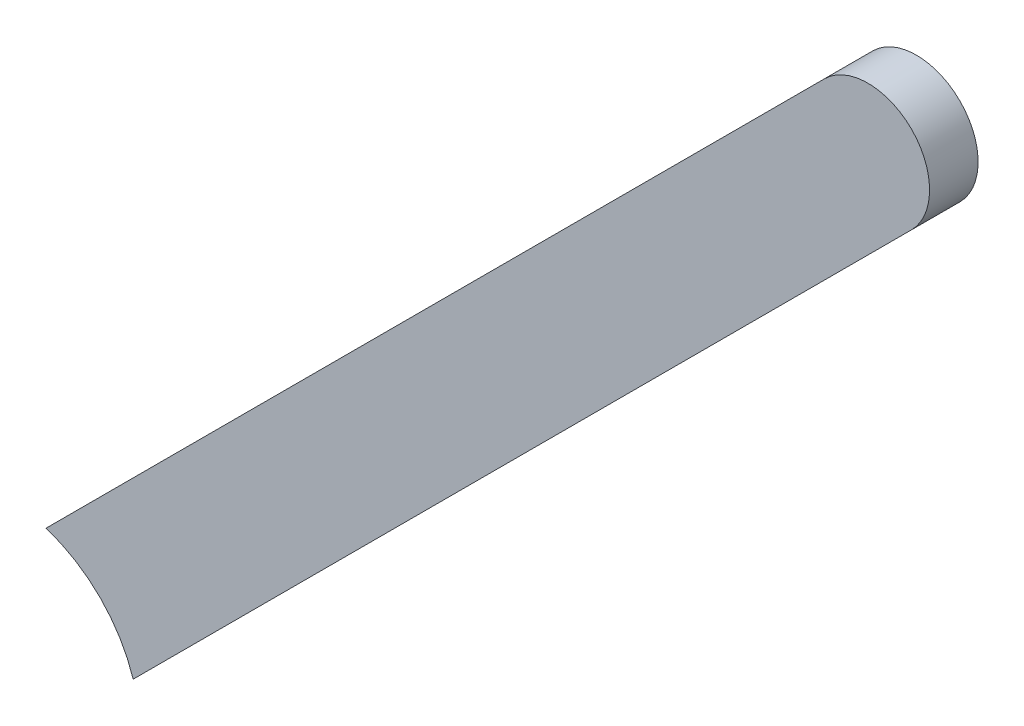
ISO-10303-21;
HEADER;
FILE_DESCRIPTION(('STEP AP214'),'2;1');
FILE_NAME('part.step','',(''),(''),'','','');
FILE_SCHEMA(('AUTOMOTIVE_DESIGN { 1 0 10303 214 1 1 1 1 }'));
ENDSEC;
DATA;
#1=APPLICATION_CONTEXT('core data for automotive mechanical design processes');
#2=APPLICATION_PROTOCOL_DEFINITION('international standard','automotive_design',2000,#1);
#3=PRODUCT_CONTEXT('',#1,'mechanical');
#4=PRODUCT('Part','Part','',(#3));
#5=PRODUCT_RELATED_PRODUCT_CATEGORY('part','',(#4));
#6=PRODUCT_DEFINITION_FORMATION('','',#4);
#7=PRODUCT_DEFINITION_CONTEXT('part definition',#1,'design');
#8=PRODUCT_DEFINITION('design','',#6,#7);
#9=PRODUCT_DEFINITION_SHAPE('','',#8);
#10=(LENGTH_UNIT() NAMED_UNIT(*) SI_UNIT(.MILLI.,.METRE.));
#11=(NAMED_UNIT(*) PLANE_ANGLE_UNIT() SI_UNIT($,.RADIAN.));
#12=(NAMED_UNIT(*) SI_UNIT($,.STERADIAN.) SOLID_ANGLE_UNIT());
#13=UNCERTAINTY_MEASURE_WITH_UNIT(LENGTH_MEASURE(1.E-05),#10,'distance_accuracy_value','');
#14=(GEOMETRIC_REPRESENTATION_CONTEXT(3) GLOBAL_UNCERTAINTY_ASSIGNED_CONTEXT((#13)) GLOBAL_UNIT_ASSIGNED_CONTEXT((#10,
#11,#12)) REPRESENTATION_CONTEXT('',''));
#15=CARTESIAN_POINT('',(0.,0.,0.));
#16=DIRECTION('',(0.,0.,1.));
#17=DIRECTION('',(1.,0.,0.));
#18=AXIS2_PLACEMENT_3D('',#15,#16,#17);
#19=CARTESIAN_POINT('',(129.553274004847,96.3083290648469,0.));
#20=DIRECTION('',(-0.707106781186548,0.707106781186548,0.));
#21=DIRECTION('',(0.707106781186548,0.707106781186548,0.));
#22=AXIS2_PLACEMENT_3D('',#19,#20,#21);
#23=PLANE('',#22);
#24=DIRECTION('',(0.707106781186548,0.707106781186548,0.));
#25=VECTOR('',#24,1.);
#26=CARTESIAN_POINT('',(129.20434154,95.9593966,0.1999996));
#27=LINE('',#26,#25);
#28=CARTESIAN_POINT('',(129.553274004847,96.3083290648469,0.1999996));
#29=VERTEX_POINT('',#28);
#30=CARTESIAN_POINT('',(132.760339,99.51539406,0.1999996));
#31=VERTEX_POINT('',#30);
#32=EDGE_CURVE('E11',#29,#31,#27,.T.);
#33=ORIENTED_EDGE('',*,*,#32,.F.);
#34=DIRECTION('',(0.,0.,1.));
#35=VECTOR('',#34,1.);
#36=CARTESIAN_POINT('',(129.553274004847,96.3083290648469,0.));
#37=LINE('',#36,#35);
#38=CARTESIAN_POINT('',(129.553274004847,96.3083290648469,0.));
#39=VERTEX_POINT('',#38);
#40=EDGE_CURVE('E24',#39,#29,#37,.T.);
#41=ORIENTED_EDGE('',*,*,#40,.F.);
#42=DIRECTION('',(0.707106781186548,0.707106781186548,0.));
#43=VECTOR('',#42,1.);
#44=CARTESIAN_POINT('',(129.20434154,95.9593966,0.));
#45=LINE('',#44,#43);
#46=CARTESIAN_POINT('',(132.760339,99.51539406,0.));
#47=VERTEX_POINT('',#46);
#48=EDGE_CURVE('E75',#39,#47,#45,.T.);
#49=ORIENTED_EDGE('',*,*,#48,.T.);
#50=DIRECTION('',(0.,0.,1.));
#51=VECTOR('',#50,1.);
#52=CARTESIAN_POINT('',(132.760339,99.51539406,0.));
#53=LINE('',#52,#51);
#54=EDGE_CURVE('E37',#47,#31,#53,.T.);
#55=ORIENTED_EDGE('',*,*,#54,.T.);
#56=EDGE_LOOP('',(#33,#41,#49,#55));
#57=FACE_BOUND('',#56,.T.);
#58=ADVANCED_FACE('F17',(#57),#23,.F.);
#59=CARTESIAN_POINT('',(132.58073433,99.69499873,0.));
#60=DIRECTION('',(0.,0.,-1.));
#61=DIRECTION('',(0.707106781186548,-0.707106781186548,0.));
#62=AXIS2_PLACEMENT_3D('',#59,#60,#61);
#63=CYLINDRICAL_SURFACE('',#62,0.253999360179542);
#64=CARTESIAN_POINT('',(132.58073433,99.69499873,0.1999996));
#65=DIRECTION('',(0.,0.,1.));
#66=DIRECTION('',(0.707106781186548,-0.707106781186548,0.));
#67=AXIS2_PLACEMENT_3D('',#64,#65,#66);
#68=CIRCLE('',#67,0.253999360179542);
#69=CARTESIAN_POINT('',(132.40112966,99.8746034,0.1999996));
#70=VERTEX_POINT('',#69);
#71=EDGE_CURVE('E83',#31,#70,#68,.T.);
#72=ORIENTED_EDGE('',*,*,#71,.F.);
#73=ORIENTED_EDGE('',*,*,#54,.F.);
#74=CARTESIAN_POINT('',(132.58073433,99.69499873,0.));
#75=DIRECTION('',(0.,0.,1.));
#76=DIRECTION('',(0.707106781186548,-0.707106781186548,0.));
#77=AXIS2_PLACEMENT_3D('',#74,#75,#76);
#78=CIRCLE('',#77,0.253999360179542);
#79=CARTESIAN_POINT('',(132.40112966,99.8746034,0.));
#80=VERTEX_POINT('',#79);
#81=EDGE_CURVE('E81',#47,#80,#78,.T.);
#82=ORIENTED_EDGE('',*,*,#81,.T.);
#83=DIRECTION('',(0.,0.,1.));
#84=VECTOR('',#83,1.);
#85=CARTESIAN_POINT('',(132.40112966,99.8746034,0.));
#86=LINE('',#85,#84);
#87=EDGE_CURVE('E67',#80,#70,#86,.T.);
#88=ORIENTED_EDGE('',*,*,#87,.T.);
#89=EDGE_LOOP('',(#72,#73,#82,#88));
#90=FACE_BOUND('',#89,.T.);
#91=ADVANCED_FACE('F89',(#90),#63,.T.);
#92=CARTESIAN_POINT('',(132.40112966,99.8746034,0.));
#93=DIRECTION('',(0.707106781186546,-0.707106781186549,0.));
#94=DIRECTION('',(-0.707106781186549,-0.707106781186546,0.));
#95=AXIS2_PLACEMENT_3D('',#92,#93,#94);
#96=PLANE('',#95);
#97=DIRECTION('',(-0.707106781186549,-0.707106781186546,0.));
#98=VECTOR('',#97,1.);
#99=CARTESIAN_POINT('',(132.40112966,99.8746034,0.1999996));
#100=LINE('',#99,#98);
#101=CARTESIAN_POINT('',(129.194064664847,96.6675384048469,0.1999996));
#102=VERTEX_POINT('',#101);
#103=EDGE_CURVE('E71',#70,#102,#100,.T.);
#104=ORIENTED_EDGE('',*,*,#103,.F.);
#105=ORIENTED_EDGE('',*,*,#87,.F.);
#106=DIRECTION('',(-0.707106781186549,-0.707106781186546,0.));
#107=VECTOR('',#106,1.);
#108=CARTESIAN_POINT('',(132.40112966,99.8746034,0.));
#109=LINE('',#108,#107);
#110=CARTESIAN_POINT('',(129.194064664847,96.6675384048469,0.));
#111=VERTEX_POINT('',#110);
#112=EDGE_CURVE('E63',#80,#111,#109,.T.);
#113=ORIENTED_EDGE('',*,*,#112,.T.);
#114=DIRECTION('',(0.,0.,1.));
#115=VECTOR('',#114,1.);
#116=CARTESIAN_POINT('',(129.194064664847,96.6675384048469,0.));
#117=LINE('',#116,#115);
#118=EDGE_CURVE('E53',#111,#102,#117,.T.);
#119=ORIENTED_EDGE('',*,*,#118,.T.);
#120=EDGE_LOOP('',(#104,#105,#113,#119));
#121=FACE_BOUND('',#120,.T.);
#122=ADVANCED_FACE('F66',(#121),#96,.F.);
#123=CARTESIAN_POINT('',(129.0247356,96.139,0.));
#124=DIRECTION('',(0.,0.,-1.));
#125=DIRECTION('',(1.,0.,0.));
#126=AXIS2_PLACEMENT_3D('',#123,#124,#125);
#127=CYLINDRICAL_SURFACE('',#126,0.55500016);
#128=ORIENTED_EDGE('',*,*,#40,.T.);
#129=CARTESIAN_POINT('',(129.0247356,96.139,0.1999996));
#130=DIRECTION('',(0.,0.,1.));
#131=DIRECTION('',(1.,0.,0.));
#132=AXIS2_PLACEMENT_3D('',#129,#130,#131);
#133=CIRCLE('',#132,0.55500016);
#134=EDGE_CURVE('E59',#29,#102,#133,.T.);
#135=ORIENTED_EDGE('',*,*,#134,.T.);
#136=ORIENTED_EDGE('',*,*,#118,.F.);
#137=CARTESIAN_POINT('',(129.0247356,96.139,0.));
#138=DIRECTION('',(0.,0.,1.));
#139=DIRECTION('',(1.,0.,0.));
#140=AXIS2_PLACEMENT_3D('',#137,#138,#139);
#141=CIRCLE('',#140,0.55500016);
#142=EDGE_CURVE('E57',#39,#111,#141,.T.);
#143=ORIENTED_EDGE('',*,*,#142,.F.);
#144=EDGE_LOOP('',(#128,#135,#136,#143));
#145=FACE_BOUND('',#144,.T.);
#146=ADVANCED_FACE('F55',(#145),#127,.F.);
#147=CARTESIAN_POINT('',(129.20434154,95.9593966,0.));
#148=DIRECTION('',(0.,0.,-1.));
#149=DIRECTION('',(-1.,0.,0.));
#150=AXIS2_PLACEMENT_3D('',#147,#148,#149);
#151=PLANE('',#150);
#152=ORIENTED_EDGE('',*,*,#48,.F.);
#153=ORIENTED_EDGE('',*,*,#142,.T.);
#154=ORIENTED_EDGE('',*,*,#112,.F.);
#155=ORIENTED_EDGE('',*,*,#81,.F.);
#156=EDGE_LOOP('',(#152,#153,#154,#155));
#157=FACE_BOUND('',#156,.T.);
#158=ADVANCED_FACE('F74',(#157),#151,.T.);
#159=CARTESIAN_POINT('',(129.20434154,95.9593966,0.1999996));
#160=DIRECTION('',(0.,0.,-1.));
#161=DIRECTION('',(-1.,0.,0.));
#162=AXIS2_PLACEMENT_3D('',#159,#160,#161);
#163=PLANE('',#162);
#164=ORIENTED_EDGE('',*,*,#134,.F.);
#165=ORIENTED_EDGE('',*,*,#32,.T.);
#166=ORIENTED_EDGE('',*,*,#71,.T.);
#167=ORIENTED_EDGE('',*,*,#103,.T.);
#168=EDGE_LOOP('',(#164,#165,#166,#167));
#169=FACE_BOUND('',#168,.T.);
#170=ADVANCED_FACE('F91',(#169),#163,.F.);
#171=CLOSED_SHELL('',(#58,#91,#122,#146,#158,#170));
#172=MANIFOLD_SOLID_BREP('B1',#171);
#173=ADVANCED_BREP_SHAPE_REPRESENTATION('',(#18,#172),#14);
#174=SHAPE_DEFINITION_REPRESENTATION(#9,#173);
ENDSEC;
END-ISO-10303-21;
